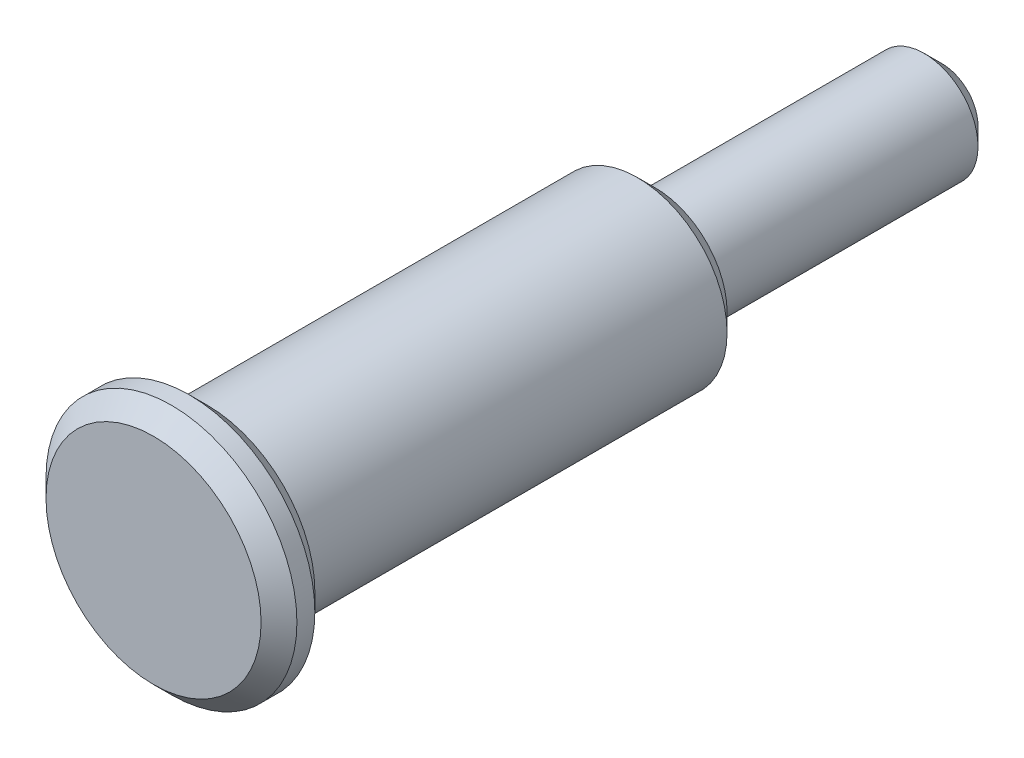
ISO-10303-21;
HEADER;
FILE_DESCRIPTION(('STEP AP214'),'2;1');
FILE_NAME('part.step','',(''),(''),'','','');
FILE_SCHEMA(('AUTOMOTIVE_DESIGN { 1 0 10303 214 1 1 1 1 }'));
ENDSEC;
DATA;
#1=APPLICATION_CONTEXT('core data for automotive mechanical design processes');
#2=APPLICATION_PROTOCOL_DEFINITION('international standard','automotive_design',2000,#1);
#3=PRODUCT_CONTEXT('',#1,'mechanical');
#4=PRODUCT('Part','Part','',(#3));
#5=PRODUCT_RELATED_PRODUCT_CATEGORY('part','',(#4));
#6=PRODUCT_DEFINITION_FORMATION('','',#4);
#7=PRODUCT_DEFINITION_CONTEXT('part definition',#1,'design');
#8=PRODUCT_DEFINITION('design','',#6,#7);
#9=PRODUCT_DEFINITION_SHAPE('','',#8);
#10=(LENGTH_UNIT() NAMED_UNIT(*) SI_UNIT(.MILLI.,.METRE.));
#11=(NAMED_UNIT(*) PLANE_ANGLE_UNIT() SI_UNIT($,.RADIAN.));
#12=(NAMED_UNIT(*) SI_UNIT($,.STERADIAN.) SOLID_ANGLE_UNIT());
#13=UNCERTAINTY_MEASURE_WITH_UNIT(LENGTH_MEASURE(1.E-05),#10,'distance_accuracy_value','');
#14=(GEOMETRIC_REPRESENTATION_CONTEXT(3) GLOBAL_UNCERTAINTY_ASSIGNED_CONTEXT((#13)) GLOBAL_UNIT_ASSIGNED_CONTEXT((#10,
#11,#12)) REPRESENTATION_CONTEXT('',''));
#15=CARTESIAN_POINT('',(0.,0.,0.));
#16=DIRECTION('',(0.,0.,1.));
#17=DIRECTION('',(1.,0.,0.));
#18=AXIS2_PLACEMENT_3D('',#15,#16,#17);
#19=CARTESIAN_POINT('',(0.,0.,0.));
#20=DIRECTION('',(0.,0.,1.));
#21=DIRECTION('',(-1.,0.,0.));
#22=AXIS2_PLACEMENT_3D('',#19,#20,#21);
#23=PLANE('',#22);
#24=CARTESIAN_POINT('',(0.,0.,0.));
#25=DIRECTION('',(0.,0.,-1.));
#26=DIRECTION('',(-1.,0.,0.));
#27=AXIS2_PLACEMENT_3D('',#24,#25,#26);
#28=CIRCLE('',#27,5.99999999999999);
#29=CARTESIAN_POINT('',(-5.99999999999999,0.,0.));
#30=VERTEX_POINT('',#29);
#31=EDGE_CURVE('E42',#30,#30,#28,.T.);
#32=ORIENTED_EDGE('',*,*,#31,.F.);
#33=EDGE_LOOP('',(#32));
#34=FACE_BOUND('',#33,.T.);
#35=ADVANCED_FACE('F35',(#34),#23,.T.);
#36=CARTESIAN_POINT('',(0.,0.,-44.));
#37=DIRECTION('',(0.,0.,-1.));
#38=DIRECTION('',(1.,0.,0.));
#39=AXIS2_PLACEMENT_3D('',#36,#37,#38);
#40=CYLINDRICAL_SURFACE('',#39,7.);
#41=CARTESIAN_POINT('',(0.,0.,-1.00000000000001));
#42=DIRECTION('',(0.,0.,-1.));
#43=DIRECTION('',(-1.,0.,0.));
#44=AXIS2_PLACEMENT_3D('',#41,#42,#43);
#45=CIRCLE('',#44,7.);
#46=CARTESIAN_POINT('',(-7.,0.,-1.00000000000001));
#47=VERTEX_POINT('',#46);
#48=EDGE_CURVE('E46',#47,#47,#45,.F.);
#49=ORIENTED_EDGE('',*,*,#48,.F.);
#50=EDGE_LOOP('',(#49));
#51=FACE_BOUND('',#50,.T.);
#52=CARTESIAN_POINT('',(0.,0.,-2.));
#53=DIRECTION('',(0.,0.,1.));
#54=DIRECTION('',(1.,0.,0.));
#55=AXIS2_PLACEMENT_3D('',#52,#53,#54);
#56=CIRCLE('',#55,7.);
#57=CARTESIAN_POINT('',(7.,0.,-2.));
#58=VERTEX_POINT('',#57);
#59=EDGE_CURVE('E50',#58,#58,#56,.F.);
#60=ORIENTED_EDGE('',*,*,#59,.F.);
#61=EDGE_LOOP('',(#60));
#62=FACE_BOUND('',#61,.T.);
#63=ADVANCED_FACE('F93',(#51,#62),#40,.T.);
#64=CARTESIAN_POINT('',(7.,0.,-3.));
#65=DIRECTION('',(0.,0.,-1.));
#66=DIRECTION('',(1.,0.,0.));
#67=AXIS2_PLACEMENT_3D('',#64,#65,#66);
#68=PLANE('',#67);
#69=CARTESIAN_POINT('',(0.,0.,-3.));
#70=DIRECTION('',(0.,0.,1.));
#71=DIRECTION('',(1.,0.,0.));
#72=AXIS2_PLACEMENT_3D('',#69,#70,#71);
#73=CIRCLE('',#72,6.00000000000001);
#74=CARTESIAN_POINT('',(6.00000000000001,0.,-3.));
#75=VERTEX_POINT('',#74);
#76=EDGE_CURVE('E10',#75,#75,#73,.T.);
#77=ORIENTED_EDGE('',*,*,#76,.F.);
#78=EDGE_LOOP('',(#77));
#79=FACE_BOUND('',#78,.T.);
#80=CARTESIAN_POINT('',(0.,0.,-3.));
#81=DIRECTION('',(0.,0.,1.));
#82=DIRECTION('',(1.,0.,0.));
#83=AXIS2_PLACEMENT_3D('',#80,#81,#82);
#84=CIRCLE('',#83,5.);
#85=CARTESIAN_POINT('',(5.,0.,-3.));
#86=VERTEX_POINT('',#85);
#87=EDGE_CURVE('E67',#86,#86,#84,.T.);
#88=ORIENTED_EDGE('',*,*,#87,.T.);
#89=EDGE_LOOP('',(#88));
#90=FACE_BOUND('',#89,.T.);
#91=ADVANCED_FACE('F99',(#79,#90),#68,.T.);
#92=CARTESIAN_POINT('',(0.,0.,-44.));
#93=DIRECTION('',(0.,0.,-1.));
#94=DIRECTION('',(1.,0.,0.));
#95=AXIS2_PLACEMENT_3D('',#92,#93,#94);
#96=CYLINDRICAL_SURFACE('',#95,5.);
#97=CARTESIAN_POINT('',(0.,0.,-27.));
#98=DIRECTION('',(0.,0.,1.));
#99=DIRECTION('',(1.,0.,0.));
#100=AXIS2_PLACEMENT_3D('',#97,#98,#99);
#101=CIRCLE('',#100,5.);
#102=CARTESIAN_POINT('',(5.,0.,-27.));
#103=VERTEX_POINT('',#102);
#104=EDGE_CURVE('E55',#103,#103,#101,.F.);
#105=ORIENTED_EDGE('',*,*,#104,.F.);
#106=EDGE_LOOP('',(#105));
#107=FACE_BOUND('',#106,.T.);
#108=ORIENTED_EDGE('',*,*,#87,.F.);
#109=EDGE_LOOP('',(#108));
#110=FACE_BOUND('',#109,.T.);
#111=ADVANCED_FACE('F88',(#107,#110),#96,.T.);
#112=CARTESIAN_POINT('',(5.,0.,-28.));
#113=DIRECTION('',(0.,0.,-1.));
#114=DIRECTION('',(1.,0.,0.));
#115=AXIS2_PLACEMENT_3D('',#112,#113,#114);
#116=PLANE('',#115);
#117=CARTESIAN_POINT('',(0.,0.,-28.));
#118=DIRECTION('',(0.,0.,1.));
#119=DIRECTION('',(1.,0.,0.));
#120=AXIS2_PLACEMENT_3D('',#117,#118,#119);
#121=CIRCLE('',#120,4.);
#122=CARTESIAN_POINT('',(4.,0.,-28.));
#123=VERTEX_POINT('',#122);
#124=EDGE_CURVE('E58',#123,#123,#121,.T.);
#125=ORIENTED_EDGE('',*,*,#124,.F.);
#126=EDGE_LOOP('',(#125));
#127=FACE_BOUND('',#126,.T.);
#128=CARTESIAN_POINT('',(0.,0.,-28.));
#129=DIRECTION('',(0.,0.,1.));
#130=DIRECTION('',(1.,0.,0.));
#131=AXIS2_PLACEMENT_3D('',#128,#129,#130);
#132=CIRCLE('',#131,3.);
#133=CARTESIAN_POINT('',(3.,0.,-28.));
#134=VERTEX_POINT('',#133);
#135=EDGE_CURVE('E70',#134,#134,#132,.T.);
#136=ORIENTED_EDGE('',*,*,#135,.T.);
#137=EDGE_LOOP('',(#136));
#138=FACE_BOUND('',#137,.T.);
#139=ADVANCED_FACE('F74',(#127,#138),#116,.T.);
#140=CARTESIAN_POINT('',(0.,0.,-44.));
#141=DIRECTION('',(0.,0.,-1.));
#142=DIRECTION('',(1.,0.,0.));
#143=AXIS2_PLACEMENT_3D('',#140,#141,#142);
#144=CYLINDRICAL_SURFACE('',#143,3.);
#145=CARTESIAN_POINT('',(0.,0.,-43.));
#146=DIRECTION('',(0.,0.,1.));
#147=DIRECTION('',(1.,0.,0.));
#148=AXIS2_PLACEMENT_3D('',#145,#146,#147);
#149=CIRCLE('',#148,3.);
#150=CARTESIAN_POINT('',(3.,0.,-43.));
#151=VERTEX_POINT('',#150);
#152=EDGE_CURVE('E61',#151,#151,#149,.F.);
#153=ORIENTED_EDGE('',*,*,#152,.F.);
#154=EDGE_LOOP('',(#153));
#155=FACE_BOUND('',#154,.T.);
#156=ORIENTED_EDGE('',*,*,#135,.F.);
#157=EDGE_LOOP('',(#156));
#158=FACE_BOUND('',#157,.T.);
#159=ADVANCED_FACE('F76',(#155,#158),#144,.T.);
#160=CARTESIAN_POINT('',(3.,0.,-44.));
#161=DIRECTION('',(0.,0.,-1.));
#162=DIRECTION('',(1.,0.,0.));
#163=AXIS2_PLACEMENT_3D('',#160,#161,#162);
#164=PLANE('',#163);
#165=CARTESIAN_POINT('',(0.,0.,-44.));
#166=DIRECTION('',(0.,0.,1.));
#167=DIRECTION('',(1.,0.,0.));
#168=AXIS2_PLACEMENT_3D('',#165,#166,#167);
#169=CIRCLE('',#168,1.99999999999999);
#170=CARTESIAN_POINT('',(1.99999999999999,0.,-44.));
#171=VERTEX_POINT('',#170);
#172=EDGE_CURVE('E64',#171,#171,#169,.T.);
#173=ORIENTED_EDGE('',*,*,#172,.F.);
#174=EDGE_LOOP('',(#173));
#175=FACE_BOUND('',#174,.T.);
#176=ADVANCED_FACE('F78',(#175),#164,.T.);
#177=CARTESIAN_POINT('',(0.,0.,-44.));
#178=DIRECTION('',(0.,0.,1.));
#179=DIRECTION('',(-1.,0.,0.));
#180=AXIS2_PLACEMENT_3D('',#177,#178,#179);
#181=CONICAL_SURFACE('',#180,1.99999999999999,0.785398163397447);
#182=ORIENTED_EDGE('',*,*,#152,.T.);
#183=EDGE_LOOP('',(#182));
#184=FACE_BOUND('',#183,.T.);
#185=ORIENTED_EDGE('',*,*,#172,.T.);
#186=EDGE_LOOP('',(#185));
#187=FACE_BOUND('',#186,.T.);
#188=ADVANCED_FACE('F85',(#184,#187),#181,.T.);
#189=CARTESIAN_POINT('',(0.,0.,-28.));
#190=DIRECTION('',(0.,0.,1.));
#191=DIRECTION('',(-1.,0.,0.));
#192=AXIS2_PLACEMENT_3D('',#189,#190,#191);
#193=CONICAL_SURFACE('',#192,4.,0.785398163397452);
#194=ORIENTED_EDGE('',*,*,#104,.T.);
#195=EDGE_LOOP('',(#194));
#196=FACE_BOUND('',#195,.T.);
#197=ORIENTED_EDGE('',*,*,#124,.T.);
#198=EDGE_LOOP('',(#197));
#199=FACE_BOUND('',#198,.T.);
#200=ADVANCED_FACE('F106',(#196,#199),#193,.T.);
#201=CARTESIAN_POINT('',(0.,0.,-1.00000000000001));
#202=DIRECTION('',(0.,0.,-1.));
#203=DIRECTION('',(1.,0.,0.));
#204=AXIS2_PLACEMENT_3D('',#201,#202,#203);
#205=CONICAL_SURFACE('',#204,7.,0.785398163397448);
#206=ORIENTED_EDGE('',*,*,#31,.T.);
#207=EDGE_LOOP('',(#206));
#208=FACE_BOUND('',#207,.T.);
#209=ORIENTED_EDGE('',*,*,#48,.T.);
#210=EDGE_LOOP('',(#209));
#211=FACE_BOUND('',#210,.T.);
#212=ADVANCED_FACE('F109',(#208,#211),#205,.T.);
#213=CARTESIAN_POINT('',(0.,0.,-3.));
#214=DIRECTION('',(0.,0.,1.));
#215=DIRECTION('',(-1.,0.,0.));
#216=AXIS2_PLACEMENT_3D('',#213,#214,#215);
#217=CONICAL_SURFACE('',#216,6.00000000000001,0.785398163397445);
#218=ORIENTED_EDGE('',*,*,#59,.T.);
#219=EDGE_LOOP('',(#218));
#220=FACE_BOUND('',#219,.T.);
#221=ORIENTED_EDGE('',*,*,#76,.T.);
#222=EDGE_LOOP('',(#221));
#223=FACE_BOUND('',#222,.T.);
#224=ADVANCED_FACE('F37',(#220,#223),#217,.T.);
#225=CLOSED_SHELL('',(#35,#63,#91,#111,#139,#159,#176,#188,#200,#212,#224));
#226=MANIFOLD_SOLID_BREP('B2',#225);
#227=ADVANCED_BREP_SHAPE_REPRESENTATION('',(#18,#226),#14);
#228=SHAPE_DEFINITION_REPRESENTATION(#9,#227);
ENDSEC;
END-ISO-10303-21;
